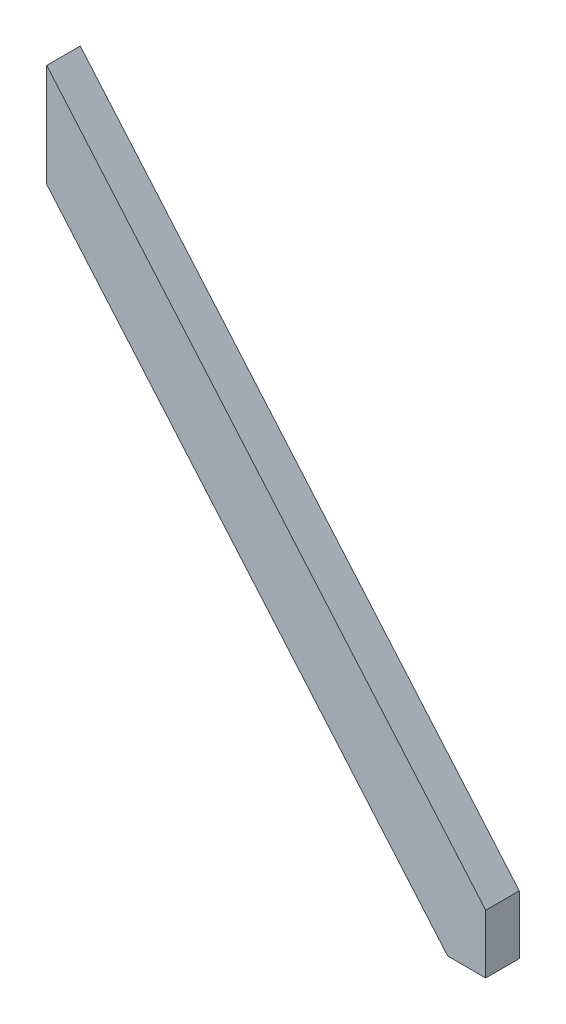
ISO-10303-21;
HEADER;
FILE_DESCRIPTION(('STEP AP214'),'2;1');
FILE_NAME('part.step','',(''),(''),'','','');
FILE_SCHEMA(('AUTOMOTIVE_DESIGN { 1 0 10303 214 1 1 1 1 }'));
ENDSEC;
DATA;
#1=APPLICATION_CONTEXT('core data for automotive mechanical design processes');
#2=APPLICATION_PROTOCOL_DEFINITION('international standard','automotive_design',2000,#1);
#3=PRODUCT_CONTEXT('',#1,'mechanical');
#4=PRODUCT('Part','Part','',(#3));
#5=PRODUCT_RELATED_PRODUCT_CATEGORY('part','',(#4));
#6=PRODUCT_DEFINITION_FORMATION('','',#4);
#7=PRODUCT_DEFINITION_CONTEXT('part definition',#1,'design');
#8=PRODUCT_DEFINITION('design','',#6,#7);
#9=PRODUCT_DEFINITION_SHAPE('','',#8);
#10=(LENGTH_UNIT() NAMED_UNIT(*) SI_UNIT(.MILLI.,.METRE.));
#11=(NAMED_UNIT(*) PLANE_ANGLE_UNIT() SI_UNIT($,.RADIAN.));
#12=(NAMED_UNIT(*) SI_UNIT($,.STERADIAN.) SOLID_ANGLE_UNIT());
#13=UNCERTAINTY_MEASURE_WITH_UNIT(LENGTH_MEASURE(1.E-05),#10,'distance_accuracy_value','');
#14=(GEOMETRIC_REPRESENTATION_CONTEXT(3) GLOBAL_UNCERTAINTY_ASSIGNED_CONTEXT((#13)) GLOBAL_UNIT_ASSIGNED_CONTEXT((#10,
#11,#12)) REPRESENTATION_CONTEXT('',''));
#15=CARTESIAN_POINT('',(0.,0.,0.));
#16=DIRECTION('',(0.,0.,1.));
#17=DIRECTION('',(1.,0.,0.));
#18=AXIS2_PLACEMENT_3D('',#15,#16,#17);
#19=CARTESIAN_POINT('',(-664.999999999987,664.150000000001,50.8));
#20=DIRECTION('',(1.,0.,0.));
#21=DIRECTION('',(0.,1.,0.));
#22=AXIS2_PLACEMENT_3D('',#19,#20,#21);
#23=PLANE('',#22);
#24=DIRECTION('',(0.,-1.,0.));
#25=VECTOR('',#24,1.);
#26=CARTESIAN_POINT('',(-664.999999999987,664.150000000001,0.));
#27=LINE('',#26,#25);
#28=CARTESIAN_POINT('',(-664.999999999987,820.265557474641,0.));
#29=VERTEX_POINT('',#28);
#30=CARTESIAN_POINT('',(-664.999999999987,664.150000000001,0.));
#31=VERTEX_POINT('',#30);
#32=EDGE_CURVE('E107',#29,#31,#27,.T.);
#33=ORIENTED_EDGE('',*,*,#32,.T.);
#34=DIRECTION('',(0.,0.,-1.));
#35=VECTOR('',#34,1.);
#36=CARTESIAN_POINT('',(-664.999999999987,664.150000000001,50.8));
#37=LINE('',#36,#35);
#38=CARTESIAN_POINT('',(-664.999999999987,664.150000000001,50.8));
#39=VERTEX_POINT('',#38);
#40=EDGE_CURVE('E11',#39,#31,#37,.T.);
#41=ORIENTED_EDGE('',*,*,#40,.F.);
#42=DIRECTION('',(0.,-1.,0.));
#43=VECTOR('',#42,1.);
#44=CARTESIAN_POINT('',(-664.999999999987,664.150000000001,50.8));
#45=LINE('',#44,#43);
#46=CARTESIAN_POINT('',(-664.999999999987,820.265557474641,50.8));
#47=VERTEX_POINT('',#46);
#48=EDGE_CURVE('E115',#47,#39,#45,.T.);
#49=ORIENTED_EDGE('',*,*,#48,.F.);
#50=DIRECTION('',(0.,0.,-1.));
#51=VECTOR('',#50,1.);
#52=CARTESIAN_POINT('',(-664.999999999987,820.265557474641,50.8));
#53=LINE('',#52,#51);
#54=EDGE_CURVE('E103',#47,#29,#53,.T.);
#55=ORIENTED_EDGE('',*,*,#54,.T.);
#56=EDGE_LOOP('',(#33,#41,#49,#55));
#57=FACE_BOUND('',#56,.T.);
#58=ADVANCED_FACE('F33',(#57),#23,.F.);
#59=CARTESIAN_POINT('',(-57.6146550426655,-44.45,50.8));
#60=DIRECTION('',(0.759249234479079,0.650799969224748,0.));
#61=DIRECTION('',(-0.650799969224748,0.759249234479079,0.));
#62=AXIS2_PLACEMENT_3D('',#59,#60,#61);
#63=PLANE('',#62);
#64=DIRECTION('',(0.650799969224748,-0.759249234479078,0.));
#65=VECTOR('',#64,1.);
#66=CARTESIAN_POINT('',(-57.6146550426655,-44.45,0.));
#67=LINE('',#66,#65);
#68=CARTESIAN_POINT('',(-57.6146550426655,-44.45,0.));
#69=VERTEX_POINT('',#68);
#70=EDGE_CURVE('E110',#31,#69,#67,.T.);
#71=ORIENTED_EDGE('',*,*,#70,.T.);
#72=DIRECTION('',(0.,0.,-1.));
#73=VECTOR('',#72,1.);
#74=CARTESIAN_POINT('',(-57.6146550426655,-44.45,50.8));
#75=LINE('',#74,#73);
#76=CARTESIAN_POINT('',(-57.6146550426655,-44.45,50.8));
#77=VERTEX_POINT('',#76);
#78=EDGE_CURVE('E41',#77,#69,#75,.T.);
#79=ORIENTED_EDGE('',*,*,#78,.F.);
#80=DIRECTION('',(0.650799969224748,-0.759249234479078,0.));
#81=VECTOR('',#80,1.);
#82=CARTESIAN_POINT('',(-57.6146550426655,-44.45,50.8));
#83=LINE('',#82,#81);
#84=EDGE_CURVE('E83',#39,#77,#83,.T.);
#85=ORIENTED_EDGE('',*,*,#84,.F.);
#86=ORIENTED_EDGE('',*,*,#40,.T.);
#87=EDGE_LOOP('',(#71,#79,#85,#86));
#88=FACE_BOUND('',#87,.T.);
#89=ADVANCED_FACE('F134',(#88),#63,.F.);
#90=CARTESIAN_POINT('',(-2.22044604925031E-13,-44.45,50.8));
#91=DIRECTION('',(0.,1.,0.));
#92=DIRECTION('',(0.,0.,1.));
#93=AXIS2_PLACEMENT_3D('',#90,#91,#92);
#94=PLANE('',#93);
#95=DIRECTION('',(1.,0.,0.));
#96=VECTOR('',#95,1.);
#97=CARTESIAN_POINT('',(-2.22044604925031E-13,-44.45,0.));
#98=LINE('',#97,#96);
#99=CARTESIAN_POINT('',(-2.22044604925031E-13,-44.45,0.));
#100=VERTEX_POINT('',#99);
#101=EDGE_CURVE('E98',#69,#100,#98,.T.);
#102=ORIENTED_EDGE('',*,*,#101,.T.);
#103=DIRECTION('',(0.,0.,-1.));
#104=VECTOR('',#103,1.);
#105=CARTESIAN_POINT('',(-2.22044604925031E-13,-44.45,50.8));
#106=LINE('',#105,#104);
#107=CARTESIAN_POINT('',(-2.22044604925031E-13,-44.45,50.8));
#108=VERTEX_POINT('',#107);
#109=EDGE_CURVE('E95',#108,#100,#106,.T.);
#110=ORIENTED_EDGE('',*,*,#109,.F.);
#111=DIRECTION('',(1.,0.,0.));
#112=VECTOR('',#111,1.);
#113=CARTESIAN_POINT('',(-2.22044604925031E-13,-44.45,50.8));
#114=LINE('',#113,#112);
#115=EDGE_CURVE('E87',#77,#108,#114,.T.);
#116=ORIENTED_EDGE('',*,*,#115,.F.);
#117=ORIENTED_EDGE('',*,*,#78,.T.);
#118=EDGE_LOOP('',(#102,#110,#116,#117));
#119=FACE_BOUND('',#118,.T.);
#120=ADVANCED_FACE('F96',(#119),#94,.F.);
#121=CARTESIAN_POINT('',(-2.22044604925031E-13,-44.45,50.8));
#122=DIRECTION('',(-1.,0.,0.));
#123=DIRECTION('',(0.,0.,1.));
#124=AXIS2_PLACEMENT_3D('',#121,#122,#123);
#125=PLANE('',#124);
#126=DIRECTION('',(0.,1.,0.));
#127=VECTOR('',#126,1.);
#128=CARTESIAN_POINT('',(-2.22044604925031E-13,-44.45,0.));
#129=LINE('',#128,#127);
#130=CARTESIAN_POINT('',(-2.22044604925031E-13,44.45,0.));
#131=VERTEX_POINT('',#130);
#132=EDGE_CURVE('E69',#100,#131,#129,.T.);
#133=ORIENTED_EDGE('',*,*,#132,.T.);
#134=DIRECTION('',(0.,0.,-1.));
#135=VECTOR('',#134,1.);
#136=CARTESIAN_POINT('',(-2.22044604925031E-13,44.45,50.8));
#137=LINE('',#136,#135);
#138=CARTESIAN_POINT('',(-2.22044604925031E-13,44.45,50.8));
#139=VERTEX_POINT('',#138);
#140=EDGE_CURVE('E99',#139,#131,#137,.T.);
#141=ORIENTED_EDGE('',*,*,#140,.F.);
#142=DIRECTION('',(0.,1.,0.));
#143=VECTOR('',#142,1.);
#144=CARTESIAN_POINT('',(-2.22044604925031E-13,-44.45,50.8));
#145=LINE('',#144,#143);
#146=EDGE_CURVE('E91',#108,#139,#145,.T.);
#147=ORIENTED_EDGE('',*,*,#146,.F.);
#148=ORIENTED_EDGE('',*,*,#109,.T.);
#149=EDGE_LOOP('',(#133,#141,#147,#148));
#150=FACE_BOUND('',#149,.T.);
#151=ADVANCED_FACE('F101',(#150),#125,.F.);
#152=CARTESIAN_POINT('',(-664.999999999987,820.265557474641,50.8));
#153=DIRECTION('',(-0.759249234479079,-0.650799969224748,0.));
#154=DIRECTION('',(0.650799969224748,-0.759249234479079,0.));
#155=AXIS2_PLACEMENT_3D('',#152,#153,#154);
#156=PLANE('',#155);
#157=DIRECTION('',(-0.650799969224748,0.759249234479079,0.));
#158=VECTOR('',#157,1.);
#159=CARTESIAN_POINT('',(-664.999999999987,820.265557474641,0.));
#160=LINE('',#159,#158);
#161=EDGE_CURVE('E75',#131,#29,#160,.T.);
#162=ORIENTED_EDGE('',*,*,#161,.T.);
#163=ORIENTED_EDGE('',*,*,#54,.F.);
#164=DIRECTION('',(-0.650799969224748,0.759249234479079,0.));
#165=VECTOR('',#164,1.);
#166=CARTESIAN_POINT('',(-664.999999999987,820.265557474641,50.8));
#167=LINE('',#166,#165);
#168=EDGE_CURVE('E49',#139,#47,#167,.T.);
#169=ORIENTED_EDGE('',*,*,#168,.F.);
#170=ORIENTED_EDGE('',*,*,#140,.T.);
#171=EDGE_LOOP('',(#162,#163,#169,#170));
#172=FACE_BOUND('',#171,.T.);
#173=ADVANCED_FACE('F123',(#172),#156,.F.);
#174=CARTESIAN_POINT('',(0.,0.,50.8));
#175=DIRECTION('',(0.,0.,1.));
#176=DIRECTION('',(1.,0.,0.));
#177=AXIS2_PLACEMENT_3D('',#174,#175,#176);
#178=PLANE('',#177);
#179=ORIENTED_EDGE('',*,*,#48,.T.);
#180=ORIENTED_EDGE('',*,*,#84,.T.);
#181=ORIENTED_EDGE('',*,*,#115,.T.);
#182=ORIENTED_EDGE('',*,*,#146,.T.);
#183=ORIENTED_EDGE('',*,*,#168,.T.);
#184=EDGE_LOOP('',(#179,#180,#181,#182,#183));
#185=FACE_BOUND('',#184,.T.);
#186=ADVANCED_FACE('F89',(#185),#178,.T.);
#187=CARTESIAN_POINT('',(0.,0.,0.));
#188=DIRECTION('',(0.,0.,1.));
#189=DIRECTION('',(1.,0.,0.));
#190=AXIS2_PLACEMENT_3D('',#187,#188,#189);
#191=PLANE('',#190);
#192=ORIENTED_EDGE('',*,*,#32,.F.);
#193=ORIENTED_EDGE('',*,*,#161,.F.);
#194=ORIENTED_EDGE('',*,*,#132,.F.);
#195=ORIENTED_EDGE('',*,*,#101,.F.);
#196=ORIENTED_EDGE('',*,*,#70,.F.);
#197=EDGE_LOOP('',(#192,#193,#194,#195,#196));
#198=FACE_BOUND('',#197,.T.);
#199=ADVANCED_FACE('F119',(#198),#191,.F.);
#200=CLOSED_SHELL('',(#58,#89,#120,#151,#173,#186,#199));
#201=MANIFOLD_SOLID_BREP('B2',#200);
#202=ADVANCED_BREP_SHAPE_REPRESENTATION('',(#18,#201),#14);
#203=SHAPE_DEFINITION_REPRESENTATION(#9,#202);
ENDSEC;
END-ISO-10303-21;
